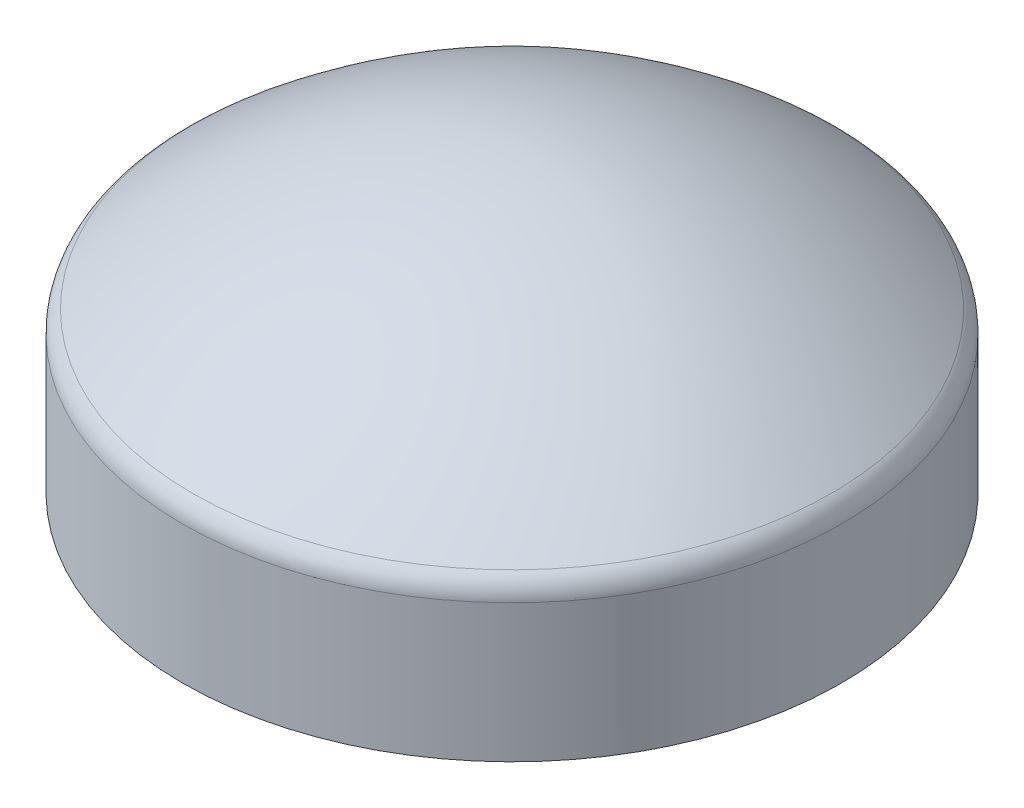
ISO-10303-21;
HEADER;
FILE_DESCRIPTION(('STEP AP214'),'2;1');
FILE_NAME('part.step','',(''),(''),'','','');
FILE_SCHEMA(('AUTOMOTIVE_DESIGN { 1 0 10303 214 1 1 1 1 }'));
ENDSEC;
DATA;
#1=APPLICATION_CONTEXT('core data for automotive mechanical design processes');
#2=APPLICATION_PROTOCOL_DEFINITION('international standard','automotive_design',2000,#1);
#3=PRODUCT_CONTEXT('',#1,'mechanical');
#4=PRODUCT('Part','Part','',(#3));
#5=PRODUCT_RELATED_PRODUCT_CATEGORY('part','',(#4));
#6=PRODUCT_DEFINITION_FORMATION('','',#4);
#7=PRODUCT_DEFINITION_CONTEXT('part definition',#1,'design');
#8=PRODUCT_DEFINITION('design','',#6,#7);
#9=PRODUCT_DEFINITION_SHAPE('','',#8);
#10=(LENGTH_UNIT() NAMED_UNIT(*) SI_UNIT(.MILLI.,.METRE.));
#11=(NAMED_UNIT(*) PLANE_ANGLE_UNIT() SI_UNIT($,.RADIAN.));
#12=(NAMED_UNIT(*) SI_UNIT($,.STERADIAN.) SOLID_ANGLE_UNIT());
#13=UNCERTAINTY_MEASURE_WITH_UNIT(LENGTH_MEASURE(1.E-05),#10,'distance_accuracy_value','');
#14=(GEOMETRIC_REPRESENTATION_CONTEXT(3) GLOBAL_UNCERTAINTY_ASSIGNED_CONTEXT((#13)) GLOBAL_UNIT_ASSIGNED_CONTEXT((#10,
#11,#12)) REPRESENTATION_CONTEXT('',''));
#15=CARTESIAN_POINT('',(0.,0.,0.));
#16=DIRECTION('',(0.,0.,1.));
#17=DIRECTION('',(1.,0.,0.));
#18=AXIS2_PLACEMENT_3D('',#15,#16,#17);
#19=CARTESIAN_POINT('',(0.,21.,0.));
#20=DIRECTION('',(0.,1.,0.));
#21=DIRECTION('',(0.,0.,1.));
#22=AXIS2_PLACEMENT_3D('',#19,#20,#21);
#23=CYLINDRICAL_SURFACE('',#22,24.05);
#24=CARTESIAN_POINT('',(0.,10.0527136670587,0.));
#25=DIRECTION('',(0.,-1.,0.));
#26=DIRECTION('',(0.,0.,-1.));
#27=AXIS2_PLACEMENT_3D('',#24,#25,#26);
#28=CIRCLE('',#27,24.05);
#29=CARTESIAN_POINT('',(0.,10.0527136670587,-24.05));
#30=VERTEX_POINT('',#29);
#31=EDGE_CURVE('E11',#30,#30,#28,.T.);
#32=ORIENTED_EDGE('',*,*,#31,.T.);
#33=EDGE_LOOP('',(#32));
#34=FACE_BOUND('',#33,.T.);
#35=CARTESIAN_POINT('',(0.,0.,0.));
#36=DIRECTION('',(0.,1.,0.));
#37=DIRECTION('',(0.,0.,1.));
#38=AXIS2_PLACEMENT_3D('',#35,#36,#37);
#39=CIRCLE('',#38,24.05);
#40=CARTESIAN_POINT('',(0.,0.,24.05));
#41=VERTEX_POINT('',#40);
#42=EDGE_CURVE('E75',#41,#41,#39,.T.);
#43=ORIENTED_EDGE('',*,*,#42,.T.);
#44=EDGE_LOOP('',(#43));
#45=FACE_BOUND('',#44,.T.);
#46=ADVANCED_FACE('F32',(#34,#45),#23,.T.);
#47=CARTESIAN_POINT('',(-24.05,0.,0.));
#48=DIRECTION('',(0.,-1.,0.));
#49=DIRECTION('',(0.,0.,-1.));
#50=AXIS2_PLACEMENT_3D('',#47,#48,#49);
#51=PLANE('',#50);
#52=CARTESIAN_POINT('',(0.,0.,0.));
#53=DIRECTION('',(0.,1.,0.));
#54=DIRECTION('',(0.,0.,1.));
#55=AXIS2_PLACEMENT_3D('',#52,#53,#54);
#56=CIRCLE('',#55,22.6);
#57=CARTESIAN_POINT('',(0.,0.,22.6));
#58=VERTEX_POINT('',#57);
#59=EDGE_CURVE('E72',#58,#58,#56,.T.);
#60=ORIENTED_EDGE('',*,*,#59,.T.);
#61=EDGE_LOOP('',(#60));
#62=FACE_BOUND('',#61,.T.);
#63=ORIENTED_EDGE('',*,*,#42,.F.);
#64=EDGE_LOOP('',(#63));
#65=FACE_BOUND('',#64,.T.);
#66=ADVANCED_FACE('F89',(#62,#65),#51,.T.);
#67=CARTESIAN_POINT('',(0.,21.,0.));
#68=DIRECTION('',(0.,1.,0.));
#69=DIRECTION('',(0.,0.,1.));
#70=AXIS2_PLACEMENT_3D('',#67,#68,#69);
#71=CYLINDRICAL_SURFACE('',#70,22.6);
#72=CARTESIAN_POINT('',(0.,2.4,0.));
#73=DIRECTION('',(0.,1.,0.));
#74=DIRECTION('',(0.,0.,1.));
#75=AXIS2_PLACEMENT_3D('',#72,#73,#74);
#76=CIRCLE('',#75,22.6);
#77=CARTESIAN_POINT('',(0.,2.4,22.6));
#78=VERTEX_POINT('',#77);
#79=EDGE_CURVE('E69',#78,#78,#76,.T.);
#80=ORIENTED_EDGE('',*,*,#79,.T.);
#81=EDGE_LOOP('',(#80));
#82=FACE_BOUND('',#81,.T.);
#83=ORIENTED_EDGE('',*,*,#59,.F.);
#84=EDGE_LOOP('',(#83));
#85=FACE_BOUND('',#84,.T.);
#86=ADVANCED_FACE('F94',(#82,#85),#71,.F.);
#87=CARTESIAN_POINT('',(0.,2.9,0.));
#88=DIRECTION('',(0.,1.,0.));
#89=DIRECTION('',(0.,0.,1.));
#90=AXIS2_PLACEMENT_3D('',#87,#88,#89);
#91=TOROIDAL_SURFACE('',#90,22.6,0.5);
#92=CARTESIAN_POINT('',(0.,3.4,0.));
#93=DIRECTION('',(0.,1.,0.));
#94=DIRECTION('',(0.,0.,1.));
#95=AXIS2_PLACEMENT_3D('',#92,#93,#94);
#96=CIRCLE('',#95,22.6);
#97=CARTESIAN_POINT('',(0.,3.4,22.6));
#98=VERTEX_POINT('',#97);
#99=EDGE_CURVE('E59',#98,#98,#96,.T.);
#100=ORIENTED_EDGE('',*,*,#99,.T.);
#101=EDGE_LOOP('',(#100));
#102=FACE_BOUND('',#101,.T.);
#103=ORIENTED_EDGE('',*,*,#79,.F.);
#104=EDGE_LOOP('',(#103));
#105=FACE_BOUND('',#104,.T.);
#106=ADVANCED_FACE('F101',(#102,#105),#91,.F.);
#107=CARTESIAN_POINT('',(0.,21.,0.));
#108=DIRECTION('',(0.,1.,0.));
#109=DIRECTION('',(0.,0.,1.));
#110=AXIS2_PLACEMENT_3D('',#107,#108,#109);
#111=CYLINDRICAL_SURFACE('',#110,22.6);
#112=CARTESIAN_POINT('',(0.,11.,0.));
#113=DIRECTION('',(0.,1.,0.));
#114=DIRECTION('',(0.,0.,1.));
#115=AXIS2_PLACEMENT_3D('',#112,#113,#114);
#116=CIRCLE('',#115,22.6);
#117=CARTESIAN_POINT('',(0.,11.,22.6));
#118=VERTEX_POINT('',#117);
#119=EDGE_CURVE('E56',#118,#118,#116,.T.);
#120=ORIENTED_EDGE('',*,*,#119,.T.);
#121=EDGE_LOOP('',(#120));
#122=FACE_BOUND('',#121,.T.);
#123=ORIENTED_EDGE('',*,*,#99,.F.);
#124=EDGE_LOOP('',(#123));
#125=FACE_BOUND('',#124,.T.);
#126=ADVANCED_FACE('F105',(#122,#125),#111,.F.);
#127=CARTESIAN_POINT('',(-22.6,11.,0.));
#128=DIRECTION('',(0.,-1.,0.));
#129=DIRECTION('',(0.,0.,-1.));
#130=AXIS2_PLACEMENT_3D('',#127,#128,#129);
#131=PLANE('',#130);
#132=CARTESIAN_POINT('',(0.,11.,0.));
#133=DIRECTION('',(0.,1.,0.));
#134=DIRECTION('',(0.,0.,1.));
#135=AXIS2_PLACEMENT_3D('',#132,#133,#134);
#136=CIRCLE('',#135,22.05);
#137=CARTESIAN_POINT('',(0.,11.,22.05));
#138=VERTEX_POINT('',#137);
#139=EDGE_CURVE('E54',#138,#138,#136,.T.);
#140=ORIENTED_EDGE('',*,*,#139,.T.);
#141=EDGE_LOOP('',(#140));
#142=FACE_BOUND('',#141,.T.);
#143=ORIENTED_EDGE('',*,*,#119,.F.);
#144=EDGE_LOOP('',(#143));
#145=FACE_BOUND('',#144,.T.);
#146=ADVANCED_FACE('F50',(#142,#145),#131,.T.);
#147=CARTESIAN_POINT('',(-22.05,11.,0.));
#148=CARTESIAN_POINT('',(-11.0249999999962,18.9999999999972,0.));
#149=CARTESIAN_POINT('',(0.,19.,0.));
#150=B_SPLINE_CURVE_WITH_KNOTS('',2,(#147,#148,#149),.UNSPECIFIED.,.F.,.F.,(3,3),(0.,
0.499999999999825),.UNSPECIFIED.);
#151=CARTESIAN_POINT('',(0.,21.,0.));
#152=DIRECTION('',(0.,1.,0.));
#153=AXIS1_PLACEMENT('',#151,#152);
#154=SURFACE_OF_REVOLUTION('',#150,#153);
#155=CARTESIAN_POINT('',(0.,19.,0.));
#156=VERTEX_POINT('',#155);
#157=VERTEX_LOOP('',#156);
#158=FACE_BOUND('',#157,.T.);
#159=ORIENTED_EDGE('',*,*,#139,.F.);
#160=EDGE_LOOP('',(#159));
#161=FACE_BOUND('',#160,.T.);
#162=ADVANCED_FACE('F46',(#158,#161),#154,.F.);
#163=CARTESIAN_POINT('',(0.,21.,0.));
#164=CARTESIAN_POINT('',(-12.025,21.,0.));
#165=CARTESIAN_POINT('',(-24.05,11.,0.));
#166=B_SPLINE_CURVE_WITH_KNOTS('',2,(#163,#164,#165),.UNSPECIFIED.,.F.,.F.,(3,3),(0.,0.5),.UNSPECIFIED.);
#167=CARTESIAN_POINT('',(0.,21.,0.));
#168=DIRECTION('',(0.,1.,0.));
#169=AXIS1_PLACEMENT('',#167,#168);
#170=SURFACE_OF_REVOLUTION('',#166,#169);
#171=CARTESIAN_POINT('',(0.,11.6100068495145,0.));
#172=DIRECTION('',(0.,1.,0.));
#173=DIRECTION('',(0.,0.,1.));
#174=AXIS2_PLACEMENT_3D('',#171,#172,#173);
#175=CIRCLE('',#174,23.3049254734352);
#176=CARTESIAN_POINT('',(0.,11.6100068495145,23.3049254734352));
#177=VERTEX_POINT('',#176);
#178=EDGE_CURVE('E40',#177,#177,#175,.T.);
#179=ORIENTED_EDGE('',*,*,#178,.T.);
#180=EDGE_LOOP('',(#179));
#181=FACE_BOUND('',#180,.T.);
#182=CARTESIAN_POINT('',(0.,21.,0.));
#183=VERTEX_POINT('',#182);
#184=VERTEX_LOOP('',#183);
#185=FACE_BOUND('',#184,.T.);
#186=ADVANCED_FACE('F49',(#181,#185),#170,.F.);
#187=CARTESIAN_POINT('',(0.,10.0527136670587,0.));
#188=DIRECTION('',(0.,-1.,0.));
#189=DIRECTION('',(0.,0.,-1.));
#190=AXIS2_PLACEMENT_3D('',#187,#188,#189);
#191=TOROIDAL_SURFACE('',#190,22.05,2.);
#192=ORIENTED_EDGE('',*,*,#31,.F.);
#193=EDGE_LOOP('',(#192));
#194=FACE_BOUND('',#193,.T.);
#195=ORIENTED_EDGE('',*,*,#178,.F.);
#196=EDGE_LOOP('',(#195));
#197=FACE_BOUND('',#196,.T.);
#198=ADVANCED_FACE('F34',(#194,#197),#191,.T.);
#199=CLOSED_SHELL('',(#46,#66,#86,#106,#126,#146,#162,#186,#198));
#200=MANIFOLD_SOLID_BREP('B2',#199);
#201=ADVANCED_BREP_SHAPE_REPRESENTATION('',(#18,#200),#14);
#202=SHAPE_DEFINITION_REPRESENTATION(#9,#201);
ENDSEC;
END-ISO-10303-21;
